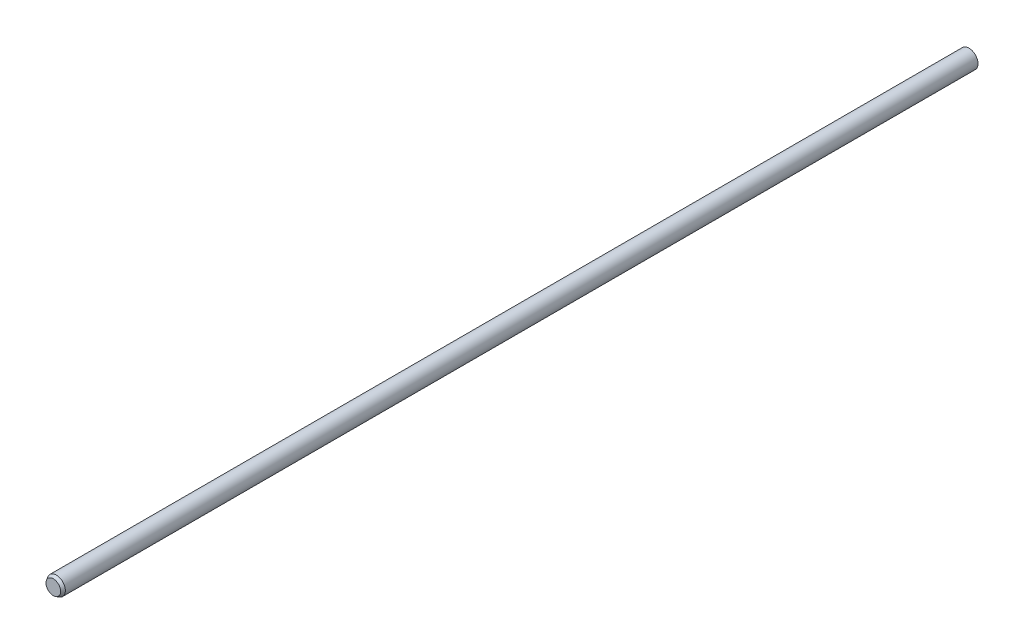
ISO-10303-21;
HEADER;
FILE_DESCRIPTION(('STEP AP214'),'2;1');
FILE_NAME('part.step','',(''),(''),'','','');
FILE_SCHEMA(('AUTOMOTIVE_DESIGN { 1 0 10303 214 1 1 1 1 }'));
ENDSEC;
DATA;
#1=APPLICATION_CONTEXT('core data for automotive mechanical design processes');
#2=APPLICATION_PROTOCOL_DEFINITION('international standard','automotive_design',2000,#1);
#3=PRODUCT_CONTEXT('',#1,'mechanical');
#4=PRODUCT('Part','Part','',(#3));
#5=PRODUCT_RELATED_PRODUCT_CATEGORY('part','',(#4));
#6=PRODUCT_DEFINITION_FORMATION('','',#4);
#7=PRODUCT_DEFINITION_CONTEXT('part definition',#1,'design');
#8=PRODUCT_DEFINITION('design','',#6,#7);
#9=PRODUCT_DEFINITION_SHAPE('','',#8);
#10=(LENGTH_UNIT() NAMED_UNIT(*) SI_UNIT(.MILLI.,.METRE.));
#11=(NAMED_UNIT(*) PLANE_ANGLE_UNIT() SI_UNIT($,.RADIAN.));
#12=(NAMED_UNIT(*) SI_UNIT($,.STERADIAN.) SOLID_ANGLE_UNIT());
#13=UNCERTAINTY_MEASURE_WITH_UNIT(LENGTH_MEASURE(1.E-05),#10,'distance_accuracy_value','');
#14=(GEOMETRIC_REPRESENTATION_CONTEXT(3) GLOBAL_UNCERTAINTY_ASSIGNED_CONTEXT((#13)) GLOBAL_UNIT_ASSIGNED_CONTEXT((#10,
#11,#12)) REPRESENTATION_CONTEXT('',''));
#15=CARTESIAN_POINT('',(0.,0.,0.));
#16=DIRECTION('',(0.,0.,1.));
#17=DIRECTION('',(1.,0.,0.));
#18=AXIS2_PLACEMENT_3D('',#15,#16,#17);
#19=CARTESIAN_POINT('',(0.,0.,304.));
#20=DIRECTION('',(0.,0.,-1.));
#21=DIRECTION('',(-1.,0.,0.));
#22=AXIS2_PLACEMENT_3D('',#19,#20,#21);
#23=CYLINDRICAL_SURFACE('',#22,3.);
#24=CARTESIAN_POINT('',(0.,0.,0.577350269189647));
#25=DIRECTION('',(0.,0.,1.));
#26=DIRECTION('',(1.,0.,0.));
#27=AXIS2_PLACEMENT_3D('',#24,#25,#26);
#28=CIRCLE('',#27,3.);
#29=CARTESIAN_POINT('',(3.,0.,0.577350269189647));
#30=VERTEX_POINT('',#29);
#31=EDGE_CURVE('E46',#30,#30,#28,.T.);
#32=ORIENTED_EDGE('',*,*,#31,.T.);
#33=EDGE_LOOP('',(#32));
#34=FACE_BOUND('',#33,.T.);
#35=CARTESIAN_POINT('',(0.,0.,303.));
#36=DIRECTION('',(0.,0.,1.));
#37=DIRECTION('',(1.,0.,0.));
#38=AXIS2_PLACEMENT_3D('',#35,#36,#37);
#39=CIRCLE('',#38,3.);
#40=CARTESIAN_POINT('',(3.,0.,303.));
#41=VERTEX_POINT('',#40);
#42=EDGE_CURVE('E50',#41,#41,#39,.F.);
#43=ORIENTED_EDGE('',*,*,#42,.T.);
#44=EDGE_LOOP('',(#43));
#45=FACE_BOUND('',#44,.T.);
#46=ADVANCED_FACE('F35',(#34,#45),#23,.T.);
#47=CARTESIAN_POINT('',(0.,0.,304.));
#48=DIRECTION('',(0.,0.,1.));
#49=DIRECTION('',(1.,0.,0.));
#50=AXIS2_PLACEMENT_3D('',#47,#48,#49);
#51=PLANE('',#50);
#52=CARTESIAN_POINT('',(0.,0.,304.));
#53=DIRECTION('',(0.,0.,1.));
#54=DIRECTION('',(1.,0.,0.));
#55=AXIS2_PLACEMENT_3D('',#52,#53,#54);
#56=CIRCLE('',#55,2.42264973081044);
#57=CARTESIAN_POINT('',(2.42264973081044,0.,304.));
#58=VERTEX_POINT('',#57);
#59=EDGE_CURVE('E10',#58,#58,#56,.T.);
#60=ORIENTED_EDGE('',*,*,#59,.T.);
#61=EDGE_LOOP('',(#60));
#62=FACE_BOUND('',#61,.T.);
#63=ADVANCED_FACE('F66',(#62),#51,.T.);
#64=CARTESIAN_POINT('',(0.,0.,0.));
#65=DIRECTION('',(0.,0.,1.));
#66=DIRECTION('',(1.,0.,0.));
#67=AXIS2_PLACEMENT_3D('',#64,#65,#66);
#68=PLANE('',#67);
#69=CARTESIAN_POINT('',(0.,0.,0.));
#70=DIRECTION('',(0.,0.,1.));
#71=DIRECTION('',(1.,0.,0.));
#72=AXIS2_PLACEMENT_3D('',#69,#70,#71);
#73=CIRCLE('',#72,2.);
#74=CARTESIAN_POINT('',(2.,0.,0.));
#75=VERTEX_POINT('',#74);
#76=EDGE_CURVE('E42',#75,#75,#73,.F.);
#77=ORIENTED_EDGE('',*,*,#76,.T.);
#78=EDGE_LOOP('',(#77));
#79=FACE_BOUND('',#78,.T.);
#80=ADVANCED_FACE('F63',(#79),#68,.F.);
#81=CARTESIAN_POINT('',(0.,0.,0.577350269189647));
#82=DIRECTION('',(0.,0.,1.));
#83=DIRECTION('',(1.,0.,0.));
#84=AXIS2_PLACEMENT_3D('',#81,#82,#83);
#85=CONICAL_SURFACE('',#84,3.,1.04719755119658);
#86=ORIENTED_EDGE('',*,*,#76,.F.);
#87=EDGE_LOOP('',(#86));
#88=FACE_BOUND('',#87,.T.);
#89=ORIENTED_EDGE('',*,*,#31,.F.);
#90=EDGE_LOOP('',(#89));
#91=FACE_BOUND('',#90,.T.);
#92=ADVANCED_FACE('F59',(#88,#91),#85,.T.);
#93=CARTESIAN_POINT('',(0.,0.,304.));
#94=DIRECTION('',(0.,0.,-1.));
#95=DIRECTION('',(-1.,0.,0.));
#96=AXIS2_PLACEMENT_3D('',#93,#94,#95);
#97=CONICAL_SURFACE('',#96,2.42264973081044,0.523598775598298);
#98=ORIENTED_EDGE('',*,*,#42,.F.);
#99=EDGE_LOOP('',(#98));
#100=FACE_BOUND('',#99,.T.);
#101=ORIENTED_EDGE('',*,*,#59,.F.);
#102=EDGE_LOOP('',(#101));
#103=FACE_BOUND('',#102,.T.);
#104=ADVANCED_FACE('F37',(#100,#103),#97,.T.);
#105=CLOSED_SHELL('',(#46,#63,#80,#92,#104));
#106=MANIFOLD_SOLID_BREP('B2',#105);
#107=ADVANCED_BREP_SHAPE_REPRESENTATION('',(#18,#106),#14);
#108=SHAPE_DEFINITION_REPRESENTATION(#9,#107);
ENDSEC;
END-ISO-10303-21;
